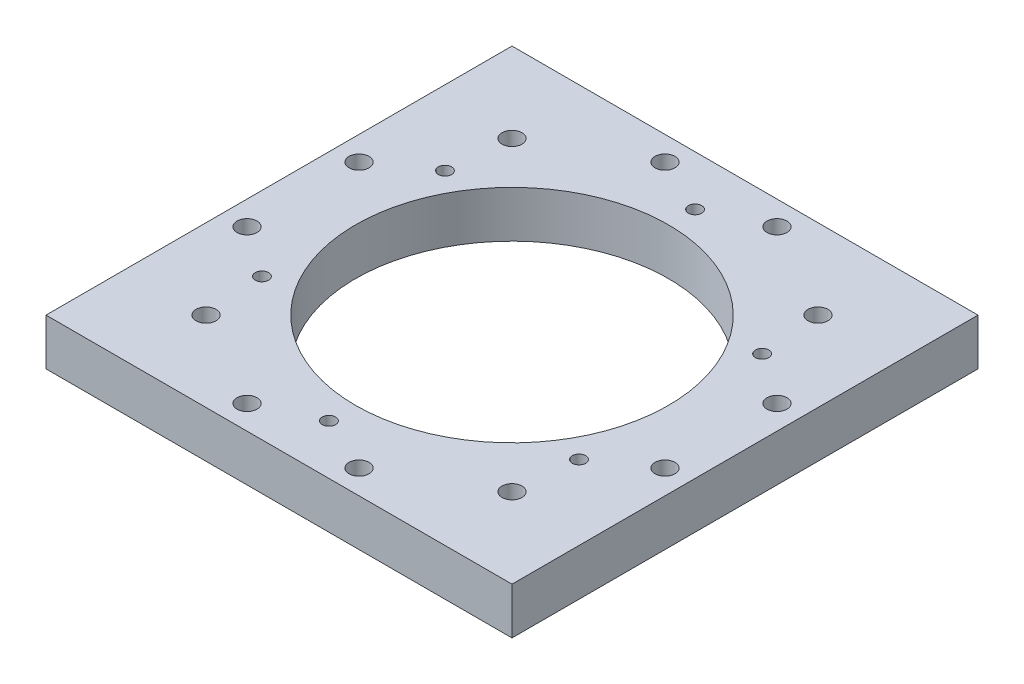
ISO-10303-21;
HEADER;
FILE_DESCRIPTION(('STEP AP214'),'2;1');
FILE_NAME('part.step','',(''),(''),'','','');
FILE_SCHEMA(('AUTOMOTIVE_DESIGN { 1 0 10303 214 1 1 1 1 }'));
ENDSEC;
DATA;
#1=APPLICATION_CONTEXT('core data for automotive mechanical design processes');
#2=APPLICATION_PROTOCOL_DEFINITION('international standard','automotive_design',2000,#1);
#3=PRODUCT_CONTEXT('',#1,'mechanical');
#4=PRODUCT('Part','Part','',(#3));
#5=PRODUCT_RELATED_PRODUCT_CATEGORY('part','',(#4));
#6=PRODUCT_DEFINITION_FORMATION('','',#4);
#7=PRODUCT_DEFINITION_CONTEXT('part definition',#1,'design');
#8=PRODUCT_DEFINITION('design','',#6,#7);
#9=PRODUCT_DEFINITION_SHAPE('','',#8);
#10=(LENGTH_UNIT() NAMED_UNIT(*) SI_UNIT(.MILLI.,.METRE.));
#11=(NAMED_UNIT(*) PLANE_ANGLE_UNIT() SI_UNIT($,.RADIAN.));
#12=(NAMED_UNIT(*) SI_UNIT($,.STERADIAN.) SOLID_ANGLE_UNIT());
#13=UNCERTAINTY_MEASURE_WITH_UNIT(LENGTH_MEASURE(1.E-05),#10,'distance_accuracy_value','');
#14=(GEOMETRIC_REPRESENTATION_CONTEXT(3) GLOBAL_UNCERTAINTY_ASSIGNED_CONTEXT((#13)) GLOBAL_UNIT_ASSIGNED_CONTEXT((#10,
#11,#12)) REPRESENTATION_CONTEXT('',''));
#15=CARTESIAN_POINT('',(0.,0.,0.));
#16=DIRECTION('',(0.,0.,1.));
#17=DIRECTION('',(1.,0.,0.));
#18=AXIS2_PLACEMENT_3D('',#15,#16,#17);
#19=CARTESIAN_POINT('',(0.,7.,0.));
#20=DIRECTION('',(0.,1.,0.));
#21=DIRECTION('',(0.,0.,1.));
#22=AXIS2_PLACEMENT_3D('',#19,#20,#21);
#23=PLANE('',#22);
#24=CARTESIAN_POINT('',(-8.4116189658321,7.,31.3925893543947));
#25=DIRECTION('',(0.,1.,0.));
#26=DIRECTION('',(0.,0.,1.));
#27=AXIS2_PLACEMENT_3D('',#24,#25,#26);
#28=CIRCLE('',#27,1.5);
#29=CARTESIAN_POINT('',(-8.4116189658321,7.,32.8925893543947));
#30=VERTEX_POINT('',#29);
#31=EDGE_CURVE('E211',#30,#30,#28,.T.);
#32=ORIENTED_EDGE('',*,*,#31,.F.);
#33=EDGE_LOOP('',(#32));
#34=FACE_BOUND('',#33,.T.);
#35=CARTESIAN_POINT('',(22.9809703885627,7.,22.9809703885629));
#36=DIRECTION('',(0.,1.,0.));
#37=DIRECTION('',(0.,0.,1.));
#38=AXIS2_PLACEMENT_3D('',#35,#36,#37);
#39=CIRCLE('',#38,1.5);
#40=CARTESIAN_POINT('',(22.9809703885627,7.,24.4809703885629));
#41=VERTEX_POINT('',#40);
#42=EDGE_CURVE('E199',#41,#41,#39,.T.);
#43=ORIENTED_EDGE('',*,*,#42,.F.);
#44=EDGE_LOOP('',(#43));
#45=FACE_BOUND('',#44,.T.);
#46=CARTESIAN_POINT('',(31.3925893543948,7.,-8.41161896583173));
#47=DIRECTION('',(0.,1.,0.));
#48=DIRECTION('',(0.,0.,1.));
#49=AXIS2_PLACEMENT_3D('',#46,#47,#48);
#50=CIRCLE('',#49,1.5);
#51=CARTESIAN_POINT('',(31.3925893543948,7.,-6.91161896583172));
#52=VERTEX_POINT('',#51);
#53=EDGE_CURVE('E187',#52,#52,#50,.T.);
#54=ORIENTED_EDGE('',*,*,#53,.F.);
#55=EDGE_LOOP('',(#54));
#56=FACE_BOUND('',#55,.T.);
#57=CARTESIAN_POINT('',(8.41161896583212,7.,-31.3925893543947));
#58=DIRECTION('',(0.,1.,0.));
#59=DIRECTION('',(0.,0.,1.));
#60=AXIS2_PLACEMENT_3D('',#57,#58,#59);
#61=CIRCLE('',#60,1.5);
#62=CARTESIAN_POINT('',(8.41161896583212,7.,-29.8925893543947));
#63=VERTEX_POINT('',#62);
#64=EDGE_CURVE('E175',#63,#63,#61,.T.);
#65=ORIENTED_EDGE('',*,*,#64,.F.);
#66=EDGE_LOOP('',(#65));
#67=FACE_BOUND('',#66,.T.);
#68=CARTESIAN_POINT('',(-22.9809703885626,7.,-22.9809703885629));
#69=DIRECTION('',(0.,1.,0.));
#70=DIRECTION('',(0.,0.,1.));
#71=AXIS2_PLACEMENT_3D('',#68,#69,#70);
#72=CIRCLE('',#71,1.5);
#73=CARTESIAN_POINT('',(-22.9809703885626,7.,-21.4809703885629));
#74=VERTEX_POINT('',#73);
#75=EDGE_CURVE('E163',#74,#74,#72,.T.);
#76=ORIENTED_EDGE('',*,*,#75,.F.);
#77=EDGE_LOOP('',(#76));
#78=FACE_BOUND('',#77,.T.);
#79=CARTESIAN_POINT('',(-31.3925893543948,7.,8.41161896583172));
#80=DIRECTION('',(0.,1.,0.));
#81=DIRECTION('',(0.,0.,1.));
#82=AXIS2_PLACEMENT_3D('',#79,#80,#81);
#83=CIRCLE('',#82,1.5);
#84=CARTESIAN_POINT('',(-31.3925893543948,7.,9.91161896583173));
#85=VERTEX_POINT('',#84);
#86=EDGE_CURVE('E151',#85,#85,#83,.T.);
#87=ORIENTED_EDGE('',*,*,#86,.F.);
#88=EDGE_LOOP('',(#87));
#89=FACE_BOUND('',#88,.T.);
#90=CARTESIAN_POINT('',(-23.8156986040701,7.,13.7500000000011));
#91=DIRECTION('',(0.,1.,0.));
#92=DIRECTION('',(0.,0.,1.));
#93=AXIS2_PLACEMENT_3D('',#90,#91,#92);
#94=CIRCLE('',#93,1.);
#95=CARTESIAN_POINT('',(-23.8156986040701,7.,14.7500000000011));
#96=VERTEX_POINT('',#95);
#97=EDGE_CURVE('E139',#96,#96,#94,.T.);
#98=ORIENTED_EDGE('',*,*,#97,.F.);
#99=EDGE_LOOP('',(#98));
#100=FACE_BOUND('',#99,.T.);
#101=CARTESIAN_POINT('',(23.815698604074,7.,13.7499999999989));
#102=DIRECTION('',(0.,1.,0.));
#103=DIRECTION('',(0.,0.,1.));
#104=AXIS2_PLACEMENT_3D('',#101,#102,#103);
#105=CIRCLE('',#104,1.);
#106=CARTESIAN_POINT('',(23.815698604074,7.,14.7499999999989));
#107=VERTEX_POINT('',#106);
#108=EDGE_CURVE('E127',#107,#107,#105,.T.);
#109=ORIENTED_EDGE('',*,*,#108,.F.);
#110=EDGE_LOOP('',(#109));
#111=FACE_BOUND('',#110,.T.);
#112=CARTESIAN_POINT('',(0.,7.,-27.5));
#113=DIRECTION('',(0.,1.,0.));
#114=DIRECTION('',(0.,0.,1.));
#115=AXIS2_PLACEMENT_3D('',#112,#113,#114);
#116=CIRCLE('',#115,1.);
#117=CARTESIAN_POINT('',(0.,7.,-26.5));
#118=VERTEX_POINT('',#117);
#119=EDGE_CURVE('E115',#118,#118,#116,.T.);
#120=ORIENTED_EDGE('',*,*,#119,.F.);
#121=EDGE_LOOP('',(#120));
#122=FACE_BOUND('',#121,.T.);
#123=DIRECTION('',(0.,0.,1.));
#124=VECTOR('',#123,1.);
#125=CARTESIAN_POINT('',(-35.,7.,-35.));
#126=LINE('',#125,#124);
#127=CARTESIAN_POINT('',(-35.,7.,-35.));
#128=VERTEX_POINT('',#127);
#129=CARTESIAN_POINT('',(-35.,7.,35.));
#130=VERTEX_POINT('',#129);
#131=EDGE_CURVE('E85',#128,#130,#126,.T.);
#132=ORIENTED_EDGE('',*,*,#131,.T.);
#133=DIRECTION('',(1.,0.,0.));
#134=VECTOR('',#133,1.);
#135=CARTESIAN_POINT('',(-35.,7.,35.));
#136=LINE('',#135,#134);
#137=CARTESIAN_POINT('',(35.,7.,35.));
#138=VERTEX_POINT('',#137);
#139=EDGE_CURVE('E80',#130,#138,#136,.T.);
#140=ORIENTED_EDGE('',*,*,#139,.T.);
#141=DIRECTION('',(0.,0.,-1.));
#142=VECTOR('',#141,1.);
#143=CARTESIAN_POINT('',(35.,7.,-35.));
#144=LINE('',#143,#142);
#145=CARTESIAN_POINT('',(35.,7.,-35.));
#146=VERTEX_POINT('',#145);
#147=EDGE_CURVE('E83',#138,#146,#144,.T.);
#148=ORIENTED_EDGE('',*,*,#147,.T.);
#149=DIRECTION('',(-1.,0.,0.));
#150=VECTOR('',#149,1.);
#151=CARTESIAN_POINT('',(-35.,7.,-35.));
#152=LINE('',#151,#150);
#153=EDGE_CURVE('E50',#146,#128,#152,.T.);
#154=ORIENTED_EDGE('',*,*,#153,.T.);
#155=EDGE_LOOP('',(#132,#140,#148,#154));
#156=FACE_BOUND('',#155,.T.);
#157=CARTESIAN_POINT('',(0.,7.,0.));
#158=DIRECTION('',(0.,1.,0.));
#159=DIRECTION('',(0.,0.,1.));
#160=AXIS2_PLACEMENT_3D('',#157,#158,#159);
#161=CIRCLE('',#160,23.5);
#162=CARTESIAN_POINT('',(0.,7.,23.5));
#163=VERTEX_POINT('',#162);
#164=EDGE_CURVE('E100',#163,#163,#161,.T.);
#165=ORIENTED_EDGE('',*,*,#164,.F.);
#166=EDGE_LOOP('',(#165));
#167=FACE_BOUND('',#166,.T.);
#168=CARTESIAN_POINT('',(23.8156986040727,7.,-13.7500000000011));
#169=DIRECTION('',(0.,1.,0.));
#170=DIRECTION('',(0.,0.,1.));
#171=AXIS2_PLACEMENT_3D('',#168,#169,#170);
#172=CIRCLE('',#171,1.);
#173=CARTESIAN_POINT('',(23.8156986040727,7.,-12.7500000000011));
#174=VERTEX_POINT('',#173);
#175=EDGE_CURVE('E121',#174,#174,#172,.T.);
#176=ORIENTED_EDGE('',*,*,#175,.F.);
#177=EDGE_LOOP('',(#176));
#178=FACE_BOUND('',#177,.T.);
#179=CARTESIAN_POINT('',(2.54662586584425E-12,7.,27.5));
#180=DIRECTION('',(0.,1.,0.));
#181=DIRECTION('',(0.,0.,1.));
#182=AXIS2_PLACEMENT_3D('',#179,#180,#181);
#183=CIRCLE('',#182,1.);
#184=CARTESIAN_POINT('',(2.54662586584425E-12,7.,28.5));
#185=VERTEX_POINT('',#184);
#186=EDGE_CURVE('E133',#185,#185,#183,.T.);
#187=ORIENTED_EDGE('',*,*,#186,.F.);
#188=EDGE_LOOP('',(#187));
#189=FACE_BOUND('',#188,.T.);
#190=CARTESIAN_POINT('',(-23.8156986040714,7.,-13.7499999999989));
#191=DIRECTION('',(0.,1.,0.));
#192=DIRECTION('',(0.,0.,1.));
#193=AXIS2_PLACEMENT_3D('',#190,#191,#192);
#194=CIRCLE('',#193,1.);
#195=CARTESIAN_POINT('',(-23.8156986040714,7.,-12.7499999999989));
#196=VERTEX_POINT('',#195);
#197=EDGE_CURVE('E145',#196,#196,#194,.T.);
#198=ORIENTED_EDGE('',*,*,#197,.F.);
#199=EDGE_LOOP('',(#198));
#200=FACE_BOUND('',#199,.T.);
#201=CARTESIAN_POINT('',(-31.3925893543947,7.,-8.41161896583212));
#202=DIRECTION('',(0.,1.,0.));
#203=DIRECTION('',(0.,0.,1.));
#204=AXIS2_PLACEMENT_3D('',#201,#202,#203);
#205=CIRCLE('',#204,1.50000000000001);
#206=CARTESIAN_POINT('',(-31.3925893543947,7.,-6.91161896583211));
#207=VERTEX_POINT('',#206);
#208=EDGE_CURVE('E157',#207,#207,#205,.T.);
#209=ORIENTED_EDGE('',*,*,#208,.F.);
#210=EDGE_LOOP('',(#209));
#211=FACE_BOUND('',#210,.T.);
#212=CARTESIAN_POINT('',(-8.41161896583172,7.,-31.3925893543948));
#213=DIRECTION('',(0.,1.,0.));
#214=DIRECTION('',(0.,0.,1.));
#215=AXIS2_PLACEMENT_3D('',#212,#213,#214);
#216=CIRCLE('',#215,1.50000000000001);
#217=CARTESIAN_POINT('',(-8.41161896583172,7.,-29.8925893543948));
#218=VERTEX_POINT('',#217);
#219=EDGE_CURVE('E169',#218,#218,#216,.T.);
#220=ORIENTED_EDGE('',*,*,#219,.F.);
#221=EDGE_LOOP('',(#220));
#222=FACE_BOUND('',#221,.T.);
#223=CARTESIAN_POINT('',(22.9809703885629,7.,-22.9809703885627));
#224=DIRECTION('',(0.,1.,0.));
#225=DIRECTION('',(0.,0.,1.));
#226=AXIS2_PLACEMENT_3D('',#223,#224,#225);
#227=CIRCLE('',#226,1.5);
#228=CARTESIAN_POINT('',(22.9809703885629,7.,-21.4809703885627));
#229=VERTEX_POINT('',#228);
#230=EDGE_CURVE('E181',#229,#229,#227,.T.);
#231=ORIENTED_EDGE('',*,*,#230,.F.);
#232=EDGE_LOOP('',(#231));
#233=FACE_BOUND('',#232,.T.);
#234=CARTESIAN_POINT('',(31.3925893543947,7.,8.41161896583211));
#235=DIRECTION('',(0.,1.,0.));
#236=DIRECTION('',(0.,0.,1.));
#237=AXIS2_PLACEMENT_3D('',#234,#235,#236);
#238=CIRCLE('',#237,1.50000000000001);
#239=CARTESIAN_POINT('',(31.3925893543947,7.,9.91161896583212));
#240=VERTEX_POINT('',#239);
#241=EDGE_CURVE('E193',#240,#240,#238,.T.);
#242=ORIENTED_EDGE('',*,*,#241,.F.);
#243=EDGE_LOOP('',(#242));
#244=FACE_BOUND('',#243,.T.);
#245=CARTESIAN_POINT('',(8.41161896583173,7.,31.3925893543948));
#246=DIRECTION('',(0.,1.,0.));
#247=DIRECTION('',(0.,0.,1.));
#248=AXIS2_PLACEMENT_3D('',#245,#246,#247);
#249=CIRCLE('',#248,1.50000000000001);
#250=CARTESIAN_POINT('',(8.41161896583173,7.,32.8925893543948));
#251=VERTEX_POINT('',#250);
#252=EDGE_CURVE('E205',#251,#251,#249,.T.);
#253=ORIENTED_EDGE('',*,*,#252,.F.);
#254=EDGE_LOOP('',(#253));
#255=FACE_BOUND('',#254,.T.);
#256=CARTESIAN_POINT('',(-22.9809703885629,7.,22.9809703885627));
#257=DIRECTION('',(0.,1.,0.));
#258=DIRECTION('',(0.,0.,1.));
#259=AXIS2_PLACEMENT_3D('',#256,#257,#258);
#260=CIRCLE('',#259,1.50000000000001);
#261=CARTESIAN_POINT('',(-22.9809703885629,7.,24.4809703885627));
#262=VERTEX_POINT('',#261);
#263=EDGE_CURVE('E217',#262,#262,#260,.T.);
#264=ORIENTED_EDGE('',*,*,#263,.F.);
#265=EDGE_LOOP('',(#264));
#266=FACE_BOUND('',#265,.T.);
#267=ADVANCED_FACE('F33',(#34,#45,#56,#67,#78,#89,#100,#111,#122,#156,#167,#178,#189,#200,#211,
#222,#233,#244,#255,#266),#23,.T.);
#268=CARTESIAN_POINT('',(0.,0.,0.));
#269=DIRECTION('',(0.,1.,0.));
#270=DIRECTION('',(0.,0.,1.));
#271=AXIS2_PLACEMENT_3D('',#268,#269,#270);
#272=PLANE('',#271);
#273=DIRECTION('',(0.,0.,1.));
#274=VECTOR('',#273,1.);
#275=CARTESIAN_POINT('',(-35.,0.,-35.));
#276=LINE('',#275,#274);
#277=CARTESIAN_POINT('',(-35.,0.,-35.));
#278=VERTEX_POINT('',#277);
#279=CARTESIAN_POINT('',(-35.,0.,35.));
#280=VERTEX_POINT('',#279);
#281=EDGE_CURVE('E97',#278,#280,#276,.T.);
#282=ORIENTED_EDGE('',*,*,#281,.F.);
#283=DIRECTION('',(-1.,0.,0.));
#284=VECTOR('',#283,1.);
#285=CARTESIAN_POINT('',(-35.,0.,-35.));
#286=LINE('',#285,#284);
#287=CARTESIAN_POINT('',(35.,0.,-35.));
#288=VERTEX_POINT('',#287);
#289=EDGE_CURVE('E73',#288,#278,#286,.T.);
#290=ORIENTED_EDGE('',*,*,#289,.F.);
#291=DIRECTION('',(0.,0.,-1.));
#292=VECTOR('',#291,1.);
#293=CARTESIAN_POINT('',(35.,0.,-35.));
#294=LINE('',#293,#292);
#295=CARTESIAN_POINT('',(35.,0.,35.));
#296=VERTEX_POINT('',#295);
#297=EDGE_CURVE('E67',#296,#288,#294,.T.);
#298=ORIENTED_EDGE('',*,*,#297,.F.);
#299=DIRECTION('',(1.,0.,0.));
#300=VECTOR('',#299,1.);
#301=CARTESIAN_POINT('',(-35.,0.,35.));
#302=LINE('',#301,#300);
#303=EDGE_CURVE('E89',#280,#296,#302,.T.);
#304=ORIENTED_EDGE('',*,*,#303,.F.);
#305=EDGE_LOOP('',(#282,#290,#298,#304));
#306=FACE_BOUND('',#305,.T.);
#307=CARTESIAN_POINT('',(0.,0.,0.));
#308=DIRECTION('',(0.,1.,0.));
#309=DIRECTION('',(0.,0.,1.));
#310=AXIS2_PLACEMENT_3D('',#307,#308,#309);
#311=CIRCLE('',#310,23.5);
#312=CARTESIAN_POINT('',(0.,0.,23.5));
#313=VERTEX_POINT('',#312);
#314=EDGE_CURVE('E112',#313,#313,#311,.T.);
#315=ORIENTED_EDGE('',*,*,#314,.T.);
#316=EDGE_LOOP('',(#315));
#317=FACE_BOUND('',#316,.T.);
#318=CARTESIAN_POINT('',(0.,0.,-27.5));
#319=DIRECTION('',(0.,1.,0.));
#320=DIRECTION('',(0.,0.,1.));
#321=AXIS2_PLACEMENT_3D('',#318,#319,#320);
#322=CIRCLE('',#321,1.);
#323=CARTESIAN_POINT('',(0.,0.,-26.5));
#324=VERTEX_POINT('',#323);
#325=EDGE_CURVE('E118',#324,#324,#322,.T.);
#326=ORIENTED_EDGE('',*,*,#325,.T.);
#327=EDGE_LOOP('',(#326));
#328=FACE_BOUND('',#327,.T.);
#329=CARTESIAN_POINT('',(23.8156986040727,0.,-13.7500000000011));
#330=DIRECTION('',(0.,1.,0.));
#331=DIRECTION('',(0.,0.,1.));
#332=AXIS2_PLACEMENT_3D('',#329,#330,#331);
#333=CIRCLE('',#332,1.);
#334=CARTESIAN_POINT('',(23.8156986040727,0.,-12.7500000000011));
#335=VERTEX_POINT('',#334);
#336=EDGE_CURVE('E124',#335,#335,#333,.T.);
#337=ORIENTED_EDGE('',*,*,#336,.T.);
#338=EDGE_LOOP('',(#337));
#339=FACE_BOUND('',#338,.T.);
#340=CARTESIAN_POINT('',(23.815698604074,0.,13.7499999999989));
#341=DIRECTION('',(0.,1.,0.));
#342=DIRECTION('',(0.,0.,1.));
#343=AXIS2_PLACEMENT_3D('',#340,#341,#342);
#344=CIRCLE('',#343,1.);
#345=CARTESIAN_POINT('',(23.815698604074,0.,14.7499999999989));
#346=VERTEX_POINT('',#345);
#347=EDGE_CURVE('E130',#346,#346,#344,.T.);
#348=ORIENTED_EDGE('',*,*,#347,.T.);
#349=EDGE_LOOP('',(#348));
#350=FACE_BOUND('',#349,.T.);
#351=CARTESIAN_POINT('',(2.54662586584425E-12,0.,27.5));
#352=DIRECTION('',(0.,1.,0.));
#353=DIRECTION('',(0.,0.,1.));
#354=AXIS2_PLACEMENT_3D('',#351,#352,#353);
#355=CIRCLE('',#354,1.);
#356=CARTESIAN_POINT('',(2.54662586584425E-12,0.,28.5));
#357=VERTEX_POINT('',#356);
#358=EDGE_CURVE('E136',#357,#357,#355,.T.);
#359=ORIENTED_EDGE('',*,*,#358,.T.);
#360=EDGE_LOOP('',(#359));
#361=FACE_BOUND('',#360,.T.);
#362=CARTESIAN_POINT('',(-23.8156986040701,0.,13.7500000000011));
#363=DIRECTION('',(0.,1.,0.));
#364=DIRECTION('',(0.,0.,1.));
#365=AXIS2_PLACEMENT_3D('',#362,#363,#364);
#366=CIRCLE('',#365,1.);
#367=CARTESIAN_POINT('',(-23.8156986040701,0.,14.7500000000011));
#368=VERTEX_POINT('',#367);
#369=EDGE_CURVE('E142',#368,#368,#366,.T.);
#370=ORIENTED_EDGE('',*,*,#369,.T.);
#371=EDGE_LOOP('',(#370));
#372=FACE_BOUND('',#371,.T.);
#373=CARTESIAN_POINT('',(-23.8156986040714,0.,-13.7499999999989));
#374=DIRECTION('',(0.,1.,0.));
#375=DIRECTION('',(0.,0.,1.));
#376=AXIS2_PLACEMENT_3D('',#373,#374,#375);
#377=CIRCLE('',#376,1.);
#378=CARTESIAN_POINT('',(-23.8156986040714,0.,-12.7499999999989));
#379=VERTEX_POINT('',#378);
#380=EDGE_CURVE('E148',#379,#379,#377,.T.);
#381=ORIENTED_EDGE('',*,*,#380,.T.);
#382=EDGE_LOOP('',(#381));
#383=FACE_BOUND('',#382,.T.);
#384=CARTESIAN_POINT('',(-31.3925893543948,0.,8.41161896583172));
#385=DIRECTION('',(0.,1.,0.));
#386=DIRECTION('',(0.,0.,1.));
#387=AXIS2_PLACEMENT_3D('',#384,#385,#386);
#388=CIRCLE('',#387,1.5);
#389=CARTESIAN_POINT('',(-31.3925893543948,0.,9.91161896583173));
#390=VERTEX_POINT('',#389);
#391=EDGE_CURVE('E154',#390,#390,#388,.T.);
#392=ORIENTED_EDGE('',*,*,#391,.T.);
#393=EDGE_LOOP('',(#392));
#394=FACE_BOUND('',#393,.T.);
#395=CARTESIAN_POINT('',(-31.3925893543947,0.,-8.41161896583212));
#396=DIRECTION('',(0.,1.,0.));
#397=DIRECTION('',(0.,0.,1.));
#398=AXIS2_PLACEMENT_3D('',#395,#396,#397);
#399=CIRCLE('',#398,1.50000000000001);
#400=CARTESIAN_POINT('',(-31.3925893543947,0.,-6.91161896583211));
#401=VERTEX_POINT('',#400);
#402=EDGE_CURVE('E160',#401,#401,#399,.T.);
#403=ORIENTED_EDGE('',*,*,#402,.T.);
#404=EDGE_LOOP('',(#403));
#405=FACE_BOUND('',#404,.T.);
#406=CARTESIAN_POINT('',(-22.9809703885626,0.,-22.9809703885629));
#407=DIRECTION('',(0.,1.,0.));
#408=DIRECTION('',(0.,0.,1.));
#409=AXIS2_PLACEMENT_3D('',#406,#407,#408);
#410=CIRCLE('',#409,1.5);
#411=CARTESIAN_POINT('',(-22.9809703885626,0.,-21.4809703885629));
#412=VERTEX_POINT('',#411);
#413=EDGE_CURVE('E166',#412,#412,#410,.T.);
#414=ORIENTED_EDGE('',*,*,#413,.T.);
#415=EDGE_LOOP('',(#414));
#416=FACE_BOUND('',#415,.T.);
#417=CARTESIAN_POINT('',(-8.41161896583172,0.,-31.3925893543948));
#418=DIRECTION('',(0.,1.,0.));
#419=DIRECTION('',(0.,0.,1.));
#420=AXIS2_PLACEMENT_3D('',#417,#418,#419);
#421=CIRCLE('',#420,1.50000000000001);
#422=CARTESIAN_POINT('',(-8.41161896583172,0.,-29.8925893543948));
#423=VERTEX_POINT('',#422);
#424=EDGE_CURVE('E172',#423,#423,#421,.T.);
#425=ORIENTED_EDGE('',*,*,#424,.T.);
#426=EDGE_LOOP('',(#425));
#427=FACE_BOUND('',#426,.T.);
#428=CARTESIAN_POINT('',(8.41161896583212,0.,-31.3925893543947));
#429=DIRECTION('',(0.,1.,0.));
#430=DIRECTION('',(0.,0.,1.));
#431=AXIS2_PLACEMENT_3D('',#428,#429,#430);
#432=CIRCLE('',#431,1.5);
#433=CARTESIAN_POINT('',(8.41161896583212,0.,-29.8925893543947));
#434=VERTEX_POINT('',#433);
#435=EDGE_CURVE('E178',#434,#434,#432,.T.);
#436=ORIENTED_EDGE('',*,*,#435,.T.);
#437=EDGE_LOOP('',(#436));
#438=FACE_BOUND('',#437,.T.);
#439=CARTESIAN_POINT('',(22.9809703885629,0.,-22.9809703885627));
#440=DIRECTION('',(0.,1.,0.));
#441=DIRECTION('',(0.,0.,1.));
#442=AXIS2_PLACEMENT_3D('',#439,#440,#441);
#443=CIRCLE('',#442,1.5);
#444=CARTESIAN_POINT('',(22.9809703885629,0.,-21.4809703885627));
#445=VERTEX_POINT('',#444);
#446=EDGE_CURVE('E184',#445,#445,#443,.T.);
#447=ORIENTED_EDGE('',*,*,#446,.T.);
#448=EDGE_LOOP('',(#447));
#449=FACE_BOUND('',#448,.T.);
#450=CARTESIAN_POINT('',(31.3925893543948,0.,-8.41161896583173));
#451=DIRECTION('',(0.,1.,0.));
#452=DIRECTION('',(0.,0.,1.));
#453=AXIS2_PLACEMENT_3D('',#450,#451,#452);
#454=CIRCLE('',#453,1.5);
#455=CARTESIAN_POINT('',(31.3925893543948,0.,-6.91161896583172));
#456=VERTEX_POINT('',#455);
#457=EDGE_CURVE('E190',#456,#456,#454,.T.);
#458=ORIENTED_EDGE('',*,*,#457,.T.);
#459=EDGE_LOOP('',(#458));
#460=FACE_BOUND('',#459,.T.);
#461=CARTESIAN_POINT('',(31.3925893543947,0.,8.41161896583211));
#462=DIRECTION('',(0.,1.,0.));
#463=DIRECTION('',(0.,0.,1.));
#464=AXIS2_PLACEMENT_3D('',#461,#462,#463);
#465=CIRCLE('',#464,1.50000000000001);
#466=CARTESIAN_POINT('',(31.3925893543947,0.,9.91161896583212));
#467=VERTEX_POINT('',#466);
#468=EDGE_CURVE('E196',#467,#467,#465,.T.);
#469=ORIENTED_EDGE('',*,*,#468,.T.);
#470=EDGE_LOOP('',(#469));
#471=FACE_BOUND('',#470,.T.);
#472=CARTESIAN_POINT('',(22.9809703885627,0.,22.9809703885629));
#473=DIRECTION('',(0.,1.,0.));
#474=DIRECTION('',(0.,0.,1.));
#475=AXIS2_PLACEMENT_3D('',#472,#473,#474);
#476=CIRCLE('',#475,1.5);
#477=CARTESIAN_POINT('',(22.9809703885627,0.,24.4809703885629));
#478=VERTEX_POINT('',#477);
#479=EDGE_CURVE('E202',#478,#478,#476,.T.);
#480=ORIENTED_EDGE('',*,*,#479,.T.);
#481=EDGE_LOOP('',(#480));
#482=FACE_BOUND('',#481,.T.);
#483=CARTESIAN_POINT('',(8.41161896583173,0.,31.3925893543948));
#484=DIRECTION('',(0.,1.,0.));
#485=DIRECTION('',(0.,0.,1.));
#486=AXIS2_PLACEMENT_3D('',#483,#484,#485);
#487=CIRCLE('',#486,1.50000000000001);
#488=CARTESIAN_POINT('',(8.41161896583173,0.,32.8925893543948));
#489=VERTEX_POINT('',#488);
#490=EDGE_CURVE('E208',#489,#489,#487,.T.);
#491=ORIENTED_EDGE('',*,*,#490,.T.);
#492=EDGE_LOOP('',(#491));
#493=FACE_BOUND('',#492,.T.);
#494=CARTESIAN_POINT('',(-8.4116189658321,0.,31.3925893543947));
#495=DIRECTION('',(0.,1.,0.));
#496=DIRECTION('',(0.,0.,1.));
#497=AXIS2_PLACEMENT_3D('',#494,#495,#496);
#498=CIRCLE('',#497,1.5);
#499=CARTESIAN_POINT('',(-8.4116189658321,0.,32.8925893543947));
#500=VERTEX_POINT('',#499);
#501=EDGE_CURVE('E214',#500,#500,#498,.T.);
#502=ORIENTED_EDGE('',*,*,#501,.T.);
#503=EDGE_LOOP('',(#502));
#504=FACE_BOUND('',#503,.T.);
#505=CARTESIAN_POINT('',(-22.9809703885629,0.,22.9809703885627));
#506=DIRECTION('',(0.,1.,0.));
#507=DIRECTION('',(0.,0.,1.));
#508=AXIS2_PLACEMENT_3D('',#505,#506,#507);
#509=CIRCLE('',#508,1.50000000000001);
#510=CARTESIAN_POINT('',(-22.9809703885629,0.,24.4809703885627));
#511=VERTEX_POINT('',#510);
#512=EDGE_CURVE('E220',#511,#511,#509,.T.);
#513=ORIENTED_EDGE('',*,*,#512,.T.);
#514=EDGE_LOOP('',(#513));
#515=FACE_BOUND('',#514,.T.);
#516=ADVANCED_FACE('F108',(#306,#317,#328,#339,#350,#361,#372,#383,#394,#405,#416,#427,#438,
#449,#460,#471,#482,#493,#504,#515),#272,.F.);
#517=CARTESIAN_POINT('',(-35.,7.,-35.));
#518=DIRECTION('',(1.,0.,0.));
#519=DIRECTION('',(0.,0.,-1.));
#520=AXIS2_PLACEMENT_3D('',#517,#518,#519);
#521=PLANE('',#520);
#522=ORIENTED_EDGE('',*,*,#281,.T.);
#523=DIRECTION('',(0.,-1.,0.));
#524=VECTOR('',#523,1.);
#525=CARTESIAN_POINT('',(-35.,7.,35.));
#526=LINE('',#525,#524);
#527=EDGE_CURVE('E11',#130,#280,#526,.T.);
#528=ORIENTED_EDGE('',*,*,#527,.F.);
#529=ORIENTED_EDGE('',*,*,#131,.F.);
#530=DIRECTION('',(0.,-1.,0.));
#531=VECTOR('',#530,1.);
#532=CARTESIAN_POINT('',(-35.,7.,-35.));
#533=LINE('',#532,#531);
#534=EDGE_CURVE('E93',#128,#278,#533,.T.);
#535=ORIENTED_EDGE('',*,*,#534,.T.);
#536=EDGE_LOOP('',(#522,#528,#529,#535));
#537=FACE_BOUND('',#536,.T.);
#538=ADVANCED_FACE('F35',(#537),#521,.F.);
#539=CARTESIAN_POINT('',(-35.,7.,35.));
#540=DIRECTION('',(0.,0.,-1.));
#541=DIRECTION('',(-1.,0.,0.));
#542=AXIS2_PLACEMENT_3D('',#539,#540,#541);
#543=PLANE('',#542);
#544=ORIENTED_EDGE('',*,*,#303,.T.);
#545=DIRECTION('',(0.,-1.,0.));
#546=VECTOR('',#545,1.);
#547=CARTESIAN_POINT('',(35.,7.,35.));
#548=LINE('',#547,#546);
#549=EDGE_CURVE('E42',#138,#296,#548,.T.);
#550=ORIENTED_EDGE('',*,*,#549,.F.);
#551=ORIENTED_EDGE('',*,*,#139,.F.);
#552=ORIENTED_EDGE('',*,*,#527,.T.);
#553=EDGE_LOOP('',(#544,#550,#551,#552));
#554=FACE_BOUND('',#553,.T.);
#555=ADVANCED_FACE('F88',(#554),#543,.F.);
#556=CARTESIAN_POINT('',(35.,7.,-35.));
#557=DIRECTION('',(-1.,0.,0.));
#558=DIRECTION('',(0.,0.,1.));
#559=AXIS2_PLACEMENT_3D('',#556,#557,#558);
#560=PLANE('',#559);
#561=ORIENTED_EDGE('',*,*,#297,.T.);
#562=DIRECTION('',(0.,-1.,0.));
#563=VECTOR('',#562,1.);
#564=CARTESIAN_POINT('',(35.,7.,-35.));
#565=LINE('',#564,#563);
#566=EDGE_CURVE('E90',#146,#288,#565,.T.);
#567=ORIENTED_EDGE('',*,*,#566,.F.);
#568=ORIENTED_EDGE('',*,*,#147,.F.);
#569=ORIENTED_EDGE('',*,*,#549,.T.);
#570=EDGE_LOOP('',(#561,#567,#568,#569));
#571=FACE_BOUND('',#570,.T.);
#572=ADVANCED_FACE('F91',(#571),#560,.F.);
#573=CARTESIAN_POINT('',(-35.,7.,-35.));
#574=DIRECTION('',(0.,0.,1.));
#575=DIRECTION('',(1.,0.,0.));
#576=AXIS2_PLACEMENT_3D('',#573,#574,#575);
#577=PLANE('',#576);
#578=ORIENTED_EDGE('',*,*,#289,.T.);
#579=ORIENTED_EDGE('',*,*,#534,.F.);
#580=ORIENTED_EDGE('',*,*,#153,.F.);
#581=ORIENTED_EDGE('',*,*,#566,.T.);
#582=EDGE_LOOP('',(#578,#579,#580,#581));
#583=FACE_BOUND('',#582,.T.);
#584=ADVANCED_FACE('F105',(#583),#577,.F.);
#585=CARTESIAN_POINT('',(0.,7.,0.));
#586=DIRECTION('',(0.,-1.,0.));
#587=DIRECTION('',(0.,0.,-1.));
#588=AXIS2_PLACEMENT_3D('',#585,#586,#587);
#589=CYLINDRICAL_SURFACE('',#588,23.5);
#590=ORIENTED_EDGE('',*,*,#164,.T.);
#591=EDGE_LOOP('',(#590));
#592=FACE_BOUND('',#591,.T.);
#593=ORIENTED_EDGE('',*,*,#314,.F.);
#594=EDGE_LOOP('',(#593));
#595=FACE_BOUND('',#594,.T.);
#596=ADVANCED_FACE('F239',(#592,#595),#589,.F.);
#597=CARTESIAN_POINT('',(0.,7.,-27.5));
#598=DIRECTION('',(0.,-1.,0.));
#599=DIRECTION('',(0.,0.,-1.));
#600=AXIS2_PLACEMENT_3D('',#597,#598,#599);
#601=CYLINDRICAL_SURFACE('',#600,1.);
#602=ORIENTED_EDGE('',*,*,#119,.T.);
#603=EDGE_LOOP('',(#602));
#604=FACE_BOUND('',#603,.T.);
#605=ORIENTED_EDGE('',*,*,#325,.F.);
#606=EDGE_LOOP('',(#605));
#607=FACE_BOUND('',#606,.T.);
#608=ADVANCED_FACE('F285',(#604,#607),#601,.F.);
#609=CARTESIAN_POINT('',(23.8156986040727,7.,-13.7500000000011));
#610=DIRECTION('',(0.,-1.,0.));
#611=DIRECTION('',(0.,0.,-1.));
#612=AXIS2_PLACEMENT_3D('',#609,#610,#611);
#613=CYLINDRICAL_SURFACE('',#612,1.);
#614=ORIENTED_EDGE('',*,*,#175,.T.);
#615=EDGE_LOOP('',(#614));
#616=FACE_BOUND('',#615,.T.);
#617=ORIENTED_EDGE('',*,*,#336,.F.);
#618=EDGE_LOOP('',(#617));
#619=FACE_BOUND('',#618,.T.);
#620=ADVANCED_FACE('F293',(#616,#619),#613,.F.);
#621=CARTESIAN_POINT('',(23.815698604074,7.,13.7499999999989));
#622=DIRECTION('',(0.,-1.,0.));
#623=DIRECTION('',(0.,0.,-1.));
#624=AXIS2_PLACEMENT_3D('',#621,#622,#623);
#625=CYLINDRICAL_SURFACE('',#624,1.);
#626=ORIENTED_EDGE('',*,*,#108,.T.);
#627=EDGE_LOOP('',(#626));
#628=FACE_BOUND('',#627,.T.);
#629=ORIENTED_EDGE('',*,*,#347,.F.);
#630=EDGE_LOOP('',(#629));
#631=FACE_BOUND('',#630,.T.);
#632=ADVANCED_FACE('F301',(#628,#631),#625,.F.);
#633=CARTESIAN_POINT('',(2.54662586584425E-12,7.,27.5));
#634=DIRECTION('',(0.,-1.,0.));
#635=DIRECTION('',(0.,0.,-1.));
#636=AXIS2_PLACEMENT_3D('',#633,#634,#635);
#637=CYLINDRICAL_SURFACE('',#636,1.);
#638=ORIENTED_EDGE('',*,*,#186,.T.);
#639=EDGE_LOOP('',(#638));
#640=FACE_BOUND('',#639,.T.);
#641=ORIENTED_EDGE('',*,*,#358,.F.);
#642=EDGE_LOOP('',(#641));
#643=FACE_BOUND('',#642,.T.);
#644=ADVANCED_FACE('F310',(#640,#643),#637,.F.);
#645=CARTESIAN_POINT('',(-23.8156986040701,7.,13.7500000000011));
#646=DIRECTION('',(0.,-1.,0.));
#647=DIRECTION('',(0.,0.,-1.));
#648=AXIS2_PLACEMENT_3D('',#645,#646,#647);
#649=CYLINDRICAL_SURFACE('',#648,1.);
#650=ORIENTED_EDGE('',*,*,#97,.T.);
#651=EDGE_LOOP('',(#650));
#652=FACE_BOUND('',#651,.T.);
#653=ORIENTED_EDGE('',*,*,#369,.F.);
#654=EDGE_LOOP('',(#653));
#655=FACE_BOUND('',#654,.T.);
#656=ADVANCED_FACE('F319',(#652,#655),#649,.F.);
#657=CARTESIAN_POINT('',(-23.8156986040714,7.,-13.7499999999989));
#658=DIRECTION('',(0.,-1.,0.));
#659=DIRECTION('',(0.,0.,-1.));
#660=AXIS2_PLACEMENT_3D('',#657,#658,#659);
#661=CYLINDRICAL_SURFACE('',#660,1.);
#662=ORIENTED_EDGE('',*,*,#197,.T.);
#663=EDGE_LOOP('',(#662));
#664=FACE_BOUND('',#663,.T.);
#665=ORIENTED_EDGE('',*,*,#380,.F.);
#666=EDGE_LOOP('',(#665));
#667=FACE_BOUND('',#666,.T.);
#668=ADVANCED_FACE('F328',(#664,#667),#661,.F.);
#669=CARTESIAN_POINT('',(-31.3925893543948,7.,8.41161896583172));
#670=DIRECTION('',(0.,-1.,0.));
#671=DIRECTION('',(0.,0.,-1.));
#672=AXIS2_PLACEMENT_3D('',#669,#670,#671);
#673=CYLINDRICAL_SURFACE('',#672,1.5);
#674=ORIENTED_EDGE('',*,*,#86,.T.);
#675=EDGE_LOOP('',(#674));
#676=FACE_BOUND('',#675,.T.);
#677=ORIENTED_EDGE('',*,*,#391,.F.);
#678=EDGE_LOOP('',(#677));
#679=FACE_BOUND('',#678,.T.);
#680=ADVANCED_FACE('F337',(#676,#679),#673,.F.);
#681=CARTESIAN_POINT('',(-31.3925893543947,7.,-8.41161896583212));
#682=DIRECTION('',(0.,-1.,0.));
#683=DIRECTION('',(0.,0.,-1.));
#684=AXIS2_PLACEMENT_3D('',#681,#682,#683);
#685=CYLINDRICAL_SURFACE('',#684,1.50000000000001);
#686=ORIENTED_EDGE('',*,*,#208,.T.);
#687=EDGE_LOOP('',(#686));
#688=FACE_BOUND('',#687,.T.);
#689=ORIENTED_EDGE('',*,*,#402,.F.);
#690=EDGE_LOOP('',(#689));
#691=FACE_BOUND('',#690,.T.);
#692=ADVANCED_FACE('F346',(#688,#691),#685,.F.);
#693=CARTESIAN_POINT('',(-22.9809703885626,7.,-22.9809703885629));
#694=DIRECTION('',(0.,-1.,0.));
#695=DIRECTION('',(0.,0.,-1.));
#696=AXIS2_PLACEMENT_3D('',#693,#694,#695);
#697=CYLINDRICAL_SURFACE('',#696,1.5);
#698=ORIENTED_EDGE('',*,*,#75,.T.);
#699=EDGE_LOOP('',(#698));
#700=FACE_BOUND('',#699,.T.);
#701=ORIENTED_EDGE('',*,*,#413,.F.);
#702=EDGE_LOOP('',(#701));
#703=FACE_BOUND('',#702,.T.);
#704=ADVANCED_FACE('F355',(#700,#703),#697,.F.);
#705=CARTESIAN_POINT('',(-8.41161896583172,7.,-31.3925893543948));
#706=DIRECTION('',(0.,-1.,0.));
#707=DIRECTION('',(0.,0.,-1.));
#708=AXIS2_PLACEMENT_3D('',#705,#706,#707);
#709=CYLINDRICAL_SURFACE('',#708,1.50000000000001);
#710=ORIENTED_EDGE('',*,*,#219,.T.);
#711=EDGE_LOOP('',(#710));
#712=FACE_BOUND('',#711,.T.);
#713=ORIENTED_EDGE('',*,*,#424,.F.);
#714=EDGE_LOOP('',(#713));
#715=FACE_BOUND('',#714,.T.);
#716=ADVANCED_FACE('F364',(#712,#715),#709,.F.);
#717=CARTESIAN_POINT('',(8.41161896583212,7.,-31.3925893543947));
#718=DIRECTION('',(0.,-1.,0.));
#719=DIRECTION('',(0.,0.,-1.));
#720=AXIS2_PLACEMENT_3D('',#717,#718,#719);
#721=CYLINDRICAL_SURFACE('',#720,1.5);
#722=ORIENTED_EDGE('',*,*,#64,.T.);
#723=EDGE_LOOP('',(#722));
#724=FACE_BOUND('',#723,.T.);
#725=ORIENTED_EDGE('',*,*,#435,.F.);
#726=EDGE_LOOP('',(#725));
#727=FACE_BOUND('',#726,.T.);
#728=ADVANCED_FACE('F373',(#724,#727),#721,.F.);
#729=CARTESIAN_POINT('',(22.9809703885629,7.,-22.9809703885627));
#730=DIRECTION('',(0.,-1.,0.));
#731=DIRECTION('',(0.,0.,-1.));
#732=AXIS2_PLACEMENT_3D('',#729,#730,#731);
#733=CYLINDRICAL_SURFACE('',#732,1.5);
#734=ORIENTED_EDGE('',*,*,#230,.T.);
#735=EDGE_LOOP('',(#734));
#736=FACE_BOUND('',#735,.T.);
#737=ORIENTED_EDGE('',*,*,#446,.F.);
#738=EDGE_LOOP('',(#737));
#739=FACE_BOUND('',#738,.T.);
#740=ADVANCED_FACE('F382',(#736,#739),#733,.F.);
#741=CARTESIAN_POINT('',(31.3925893543948,7.,-8.41161896583173));
#742=DIRECTION('',(0.,-1.,0.));
#743=DIRECTION('',(0.,0.,-1.));
#744=AXIS2_PLACEMENT_3D('',#741,#742,#743);
#745=CYLINDRICAL_SURFACE('',#744,1.5);
#746=ORIENTED_EDGE('',*,*,#53,.T.);
#747=EDGE_LOOP('',(#746));
#748=FACE_BOUND('',#747,.T.);
#749=ORIENTED_EDGE('',*,*,#457,.F.);
#750=EDGE_LOOP('',(#749));
#751=FACE_BOUND('',#750,.T.);
#752=ADVANCED_FACE('F391',(#748,#751),#745,.F.);
#753=CARTESIAN_POINT('',(31.3925893543947,7.,8.41161896583211));
#754=DIRECTION('',(0.,-1.,0.));
#755=DIRECTION('',(0.,0.,-1.));
#756=AXIS2_PLACEMENT_3D('',#753,#754,#755);
#757=CYLINDRICAL_SURFACE('',#756,1.50000000000001);
#758=ORIENTED_EDGE('',*,*,#241,.T.);
#759=EDGE_LOOP('',(#758));
#760=FACE_BOUND('',#759,.T.);
#761=ORIENTED_EDGE('',*,*,#468,.F.);
#762=EDGE_LOOP('',(#761));
#763=FACE_BOUND('',#762,.T.);
#764=ADVANCED_FACE('F400',(#760,#763),#757,.F.);
#765=CARTESIAN_POINT('',(22.9809703885627,7.,22.9809703885629));
#766=DIRECTION('',(0.,-1.,0.));
#767=DIRECTION('',(0.,0.,-1.));
#768=AXIS2_PLACEMENT_3D('',#765,#766,#767);
#769=CYLINDRICAL_SURFACE('',#768,1.5);
#770=ORIENTED_EDGE('',*,*,#42,.T.);
#771=EDGE_LOOP('',(#770));
#772=FACE_BOUND('',#771,.T.);
#773=ORIENTED_EDGE('',*,*,#479,.F.);
#774=EDGE_LOOP('',(#773));
#775=FACE_BOUND('',#774,.T.);
#776=ADVANCED_FACE('F409',(#772,#775),#769,.F.);
#777=CARTESIAN_POINT('',(8.41161896583173,7.,31.3925893543948));
#778=DIRECTION('',(0.,-1.,0.));
#779=DIRECTION('',(0.,0.,-1.));
#780=AXIS2_PLACEMENT_3D('',#777,#778,#779);
#781=CYLINDRICAL_SURFACE('',#780,1.50000000000001);
#782=ORIENTED_EDGE('',*,*,#252,.T.);
#783=EDGE_LOOP('',(#782));
#784=FACE_BOUND('',#783,.T.);
#785=ORIENTED_EDGE('',*,*,#490,.F.);
#786=EDGE_LOOP('',(#785));
#787=FACE_BOUND('',#786,.T.);
#788=ADVANCED_FACE('F418',(#784,#787),#781,.F.);
#789=CARTESIAN_POINT('',(-8.4116189658321,7.,31.3925893543947));
#790=DIRECTION('',(0.,-1.,0.));
#791=DIRECTION('',(0.,0.,-1.));
#792=AXIS2_PLACEMENT_3D('',#789,#790,#791);
#793=CYLINDRICAL_SURFACE('',#792,1.5);
#794=ORIENTED_EDGE('',*,*,#31,.T.);
#795=EDGE_LOOP('',(#794));
#796=FACE_BOUND('',#795,.T.);
#797=ORIENTED_EDGE('',*,*,#501,.F.);
#798=EDGE_LOOP('',(#797));
#799=FACE_BOUND('',#798,.T.);
#800=ADVANCED_FACE('F427',(#796,#799),#793,.F.);
#801=CARTESIAN_POINT('',(-22.9809703885629,7.,22.9809703885627));
#802=DIRECTION('',(0.,-1.,0.));
#803=DIRECTION('',(0.,0.,-1.));
#804=AXIS2_PLACEMENT_3D('',#801,#802,#803);
#805=CYLINDRICAL_SURFACE('',#804,1.50000000000001);
#806=ORIENTED_EDGE('',*,*,#263,.T.);
#807=EDGE_LOOP('',(#806));
#808=FACE_BOUND('',#807,.T.);
#809=ORIENTED_EDGE('',*,*,#512,.F.);
#810=EDGE_LOOP('',(#809));
#811=FACE_BOUND('',#810,.T.);
#812=ADVANCED_FACE('F226',(#808,#811),#805,.F.);
#813=CLOSED_SHELL('',(#267,#516,#538,#555,#572,#584,#596,#608,#620,#632,#644,#656,#668,#680,
#692,#704,#716,#728,#740,#752,#764,#776,#788,#800,#812));
#814=MANIFOLD_SOLID_BREP('B2',#813);
#815=ADVANCED_BREP_SHAPE_REPRESENTATION('',(#18,#814),#14);
#816=SHAPE_DEFINITION_REPRESENTATION(#9,#815);
ENDSEC;
END-ISO-10303-21;
